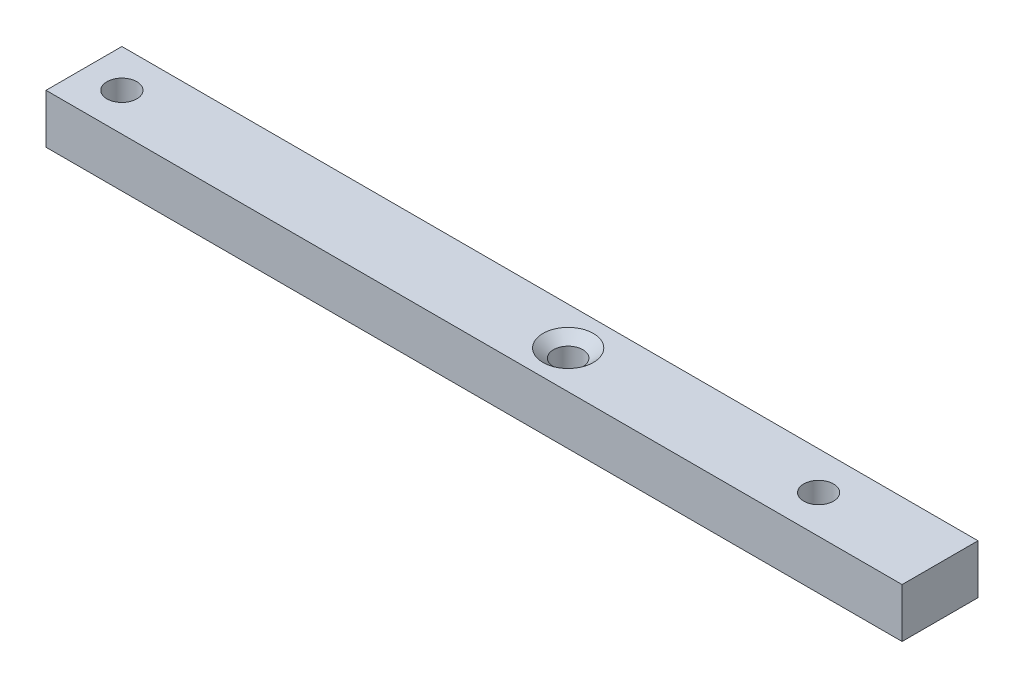
ISO-10303-21;
HEADER;
FILE_DESCRIPTION(('STEP AP214'),'2;1');
FILE_NAME('part.step','',(''),(''),'','','');
FILE_SCHEMA(('AUTOMOTIVE_DESIGN { 1 0 10303 214 1 1 1 1 }'));
ENDSEC;
DATA;
#1=APPLICATION_CONTEXT('core data for automotive mechanical design processes');
#2=APPLICATION_PROTOCOL_DEFINITION('international standard','automotive_design',2000,#1);
#3=PRODUCT_CONTEXT('',#1,'mechanical');
#4=PRODUCT('Part','Part','',(#3));
#5=PRODUCT_RELATED_PRODUCT_CATEGORY('part','',(#4));
#6=PRODUCT_DEFINITION_FORMATION('','',#4);
#7=PRODUCT_DEFINITION_CONTEXT('part definition',#1,'design');
#8=PRODUCT_DEFINITION('design','',#6,#7);
#9=PRODUCT_DEFINITION_SHAPE('','',#8);
#10=(LENGTH_UNIT() NAMED_UNIT(*) SI_UNIT(.MILLI.,.METRE.));
#11=(NAMED_UNIT(*) PLANE_ANGLE_UNIT() SI_UNIT($,.RADIAN.));
#12=(NAMED_UNIT(*) SI_UNIT($,.STERADIAN.) SOLID_ANGLE_UNIT());
#13=UNCERTAINTY_MEASURE_WITH_UNIT(LENGTH_MEASURE(1.E-05),#10,'distance_accuracy_value','');
#14=(GEOMETRIC_REPRESENTATION_CONTEXT(3) GLOBAL_UNCERTAINTY_ASSIGNED_CONTEXT((#13)) GLOBAL_UNIT_ASSIGNED_CONTEXT((#10,
#11,#12)) REPRESENTATION_CONTEXT('',''));
#15=CARTESIAN_POINT('',(0.,0.,0.));
#16=DIRECTION('',(0.,0.,1.));
#17=DIRECTION('',(1.,0.,0.));
#18=AXIS2_PLACEMENT_3D('',#15,#16,#17);
#19=CARTESIAN_POINT('',(-64.4962077922078,8.255,-10.749367965368));
#20=DIRECTION('',(1.,0.,0.));
#21=DIRECTION('',(0.,0.,-1.));
#22=AXIS2_PLACEMENT_3D('',#19,#20,#21);
#23=PLANE('',#22);
#24=DIRECTION('',(0.,0.,1.));
#25=VECTOR('',#24,1.);
#26=CARTESIAN_POINT('',(-64.4962077922078,0.,-10.749367965368));
#27=LINE('',#26,#25);
#28=CARTESIAN_POINT('',(-64.4962077922078,0.,-10.749367965368));
#29=VERTEX_POINT('',#28);
#30=CARTESIAN_POINT('',(-64.4962077922078,0.,1.95063203463203));
#31=VERTEX_POINT('',#30);
#32=EDGE_CURVE('E125',#29,#31,#27,.T.);
#33=ORIENTED_EDGE('',*,*,#32,.T.);
#34=DIRECTION('',(0.,-1.,0.));
#35=VECTOR('',#34,1.);
#36=CARTESIAN_POINT('',(-64.4962077922078,8.255,1.95063203463203));
#37=LINE('',#36,#35);
#38=CARTESIAN_POINT('',(-64.4962077922078,8.255,1.95063203463203));
#39=VERTEX_POINT('',#38);
#40=EDGE_CURVE('E11',#39,#31,#37,.T.);
#41=ORIENTED_EDGE('',*,*,#40,.F.);
#42=DIRECTION('',(0.,0.,1.));
#43=VECTOR('',#42,1.);
#44=CARTESIAN_POINT('',(-64.4962077922078,8.255,-10.749367965368));
#45=LINE('',#44,#43);
#46=CARTESIAN_POINT('',(-64.4962077922078,8.255,-10.749367965368));
#47=VERTEX_POINT('',#46);
#48=EDGE_CURVE('E126',#47,#39,#45,.T.);
#49=ORIENTED_EDGE('',*,*,#48,.F.);
#50=DIRECTION('',(0.,-1.,0.));
#51=VECTOR('',#50,1.);
#52=CARTESIAN_POINT('',(-64.4962077922078,8.255,-10.749367965368));
#53=LINE('',#52,#51);
#54=EDGE_CURVE('E132',#47,#29,#53,.T.);
#55=ORIENTED_EDGE('',*,*,#54,.T.);
#56=EDGE_LOOP('',(#33,#41,#49,#55));
#57=FACE_BOUND('',#56,.T.);
#58=ADVANCED_FACE('F39',(#57),#23,.F.);
#59=CARTESIAN_POINT('',(-64.4962077922078,8.255,1.95063203463203));
#60=DIRECTION('',(0.,0.,-1.));
#61=DIRECTION('',(-1.,0.,0.));
#62=AXIS2_PLACEMENT_3D('',#59,#60,#61);
#63=PLANE('',#62);
#64=DIRECTION('',(1.,0.,0.));
#65=VECTOR('',#64,1.);
#66=CARTESIAN_POINT('',(-64.4962077922078,0.,1.95063203463203));
#67=LINE('',#66,#65);
#68=CARTESIAN_POINT('',(78.7597922077922,0.,1.95063203463203));
#69=VERTEX_POINT('',#68);
#70=EDGE_CURVE('E135',#31,#69,#67,.T.);
#71=ORIENTED_EDGE('',*,*,#70,.T.);
#72=DIRECTION('',(0.,-1.,0.));
#73=VECTOR('',#72,1.);
#74=CARTESIAN_POINT('',(78.7597922077922,8.255,1.95063203463203));
#75=LINE('',#74,#73);
#76=CARTESIAN_POINT('',(78.7597922077922,8.255,1.95063203463203));
#77=VERTEX_POINT('',#76);
#78=EDGE_CURVE('E47',#77,#69,#75,.T.);
#79=ORIENTED_EDGE('',*,*,#78,.F.);
#80=DIRECTION('',(1.,0.,0.));
#81=VECTOR('',#80,1.);
#82=CARTESIAN_POINT('',(-64.4962077922078,8.255,1.95063203463203));
#83=LINE('',#82,#81);
#84=EDGE_CURVE('E86',#39,#77,#83,.T.);
#85=ORIENTED_EDGE('',*,*,#84,.F.);
#86=ORIENTED_EDGE('',*,*,#40,.T.);
#87=EDGE_LOOP('',(#71,#79,#85,#86));
#88=FACE_BOUND('',#87,.T.);
#89=ADVANCED_FACE('F159',(#88),#63,.F.);
#90=CARTESIAN_POINT('',(78.7597922077922,8.255,-10.749367965368));
#91=DIRECTION('',(-1.,0.,0.));
#92=DIRECTION('',(0.,0.,1.));
#93=AXIS2_PLACEMENT_3D('',#90,#91,#92);
#94=PLANE('',#93);
#95=DIRECTION('',(0.,0.,-1.));
#96=VECTOR('',#95,1.);
#97=CARTESIAN_POINT('',(78.7597922077922,0.,-10.749367965368));
#98=LINE('',#97,#96);
#99=CARTESIAN_POINT('',(78.7597922077922,0.,-10.749367965368));
#100=VERTEX_POINT('',#99);
#101=EDGE_CURVE('E73',#69,#100,#98,.T.);
#102=ORIENTED_EDGE('',*,*,#101,.T.);
#103=DIRECTION('',(0.,-1.,0.));
#104=VECTOR('',#103,1.);
#105=CARTESIAN_POINT('',(78.7597922077922,8.255,-10.749367965368));
#106=LINE('',#105,#104);
#107=CARTESIAN_POINT('',(78.7597922077922,8.255,-10.749367965368));
#108=VERTEX_POINT('',#107);
#109=EDGE_CURVE('E140',#108,#100,#106,.T.);
#110=ORIENTED_EDGE('',*,*,#109,.F.);
#111=DIRECTION('',(0.,0.,-1.));
#112=VECTOR('',#111,1.);
#113=CARTESIAN_POINT('',(78.7597922077922,8.255,-10.749367965368));
#114=LINE('',#113,#112);
#115=EDGE_CURVE('E129',#77,#108,#114,.T.);
#116=ORIENTED_EDGE('',*,*,#115,.F.);
#117=ORIENTED_EDGE('',*,*,#78,.T.);
#118=EDGE_LOOP('',(#102,#110,#116,#117));
#119=FACE_BOUND('',#118,.T.);
#120=ADVANCED_FACE('F142',(#119),#94,.F.);
#121=CARTESIAN_POINT('',(-64.4962077922078,8.255,-10.749367965368));
#122=DIRECTION('',(0.,0.,1.));
#123=DIRECTION('',(1.,0.,0.));
#124=AXIS2_PLACEMENT_3D('',#121,#122,#123);
#125=PLANE('',#124);
#126=DIRECTION('',(-1.,0.,0.));
#127=VECTOR('',#126,1.);
#128=CARTESIAN_POINT('',(-64.4962077922078,0.,-10.749367965368));
#129=LINE('',#128,#127);
#130=EDGE_CURVE('E79',#100,#29,#129,.T.);
#131=ORIENTED_EDGE('',*,*,#130,.T.);
#132=ORIENTED_EDGE('',*,*,#54,.F.);
#133=DIRECTION('',(-1.,0.,0.));
#134=VECTOR('',#133,1.);
#135=CARTESIAN_POINT('',(-64.4962077922078,8.255,-10.749367965368));
#136=LINE('',#135,#134);
#137=EDGE_CURVE('E55',#108,#47,#136,.T.);
#138=ORIENTED_EDGE('',*,*,#137,.F.);
#139=ORIENTED_EDGE('',*,*,#109,.T.);
#140=EDGE_LOOP('',(#131,#132,#138,#139));
#141=FACE_BOUND('',#140,.T.);
#142=ADVANCED_FACE('F149',(#141),#125,.F.);
#143=CARTESIAN_POINT('',(0.,8.255,0.));
#144=DIRECTION('',(0.,1.,0.));
#145=DIRECTION('',(0.,0.,1.));
#146=AXIS2_PLACEMENT_3D('',#143,#144,#145);
#147=PLANE('',#146);
#148=CARTESIAN_POINT('',(58.4397922077922,8.255,-4.39936796536797));
#149=DIRECTION('',(0.,1.,0.));
#150=DIRECTION('',(0.,0.,1.));
#151=AXIS2_PLACEMENT_3D('',#148,#149,#150);
#152=CIRCLE('',#151,2.5);
#153=CARTESIAN_POINT('',(58.4397922077922,8.255,-1.89936796536796));
#154=VERTEX_POINT('',#153);
#155=EDGE_CURVE('E274',#154,#154,#152,.T.);
#156=ORIENTED_EDGE('',*,*,#155,.F.);
#157=EDGE_LOOP('',(#156));
#158=FACE_BOUND('',#157,.T.);
#159=CARTESIAN_POINT('',(-58.1462077922078,8.255,-4.39936796536797));
#160=DIRECTION('',(0.,1.,0.));
#161=DIRECTION('',(0.,0.,1.));
#162=AXIS2_PLACEMENT_3D('',#159,#160,#161);
#163=CIRCLE('',#162,2.5);
#164=CARTESIAN_POINT('',(-58.1462077922078,8.255,-1.89936796536796));
#165=VERTEX_POINT('',#164);
#166=EDGE_CURVE('E276',#165,#165,#163,.T.);
#167=ORIENTED_EDGE('',*,*,#166,.F.);
#168=EDGE_LOOP('',(#167));
#169=FACE_BOUND('',#168,.T.);
#170=CARTESIAN_POINT('',(16.5297922077922,8.255,-4.39936796536797));
#171=DIRECTION('',(0.,1.,0.));
#172=DIRECTION('',(0.,0.,1.));
#173=AXIS2_PLACEMENT_3D('',#170,#171,#172);
#174=CIRCLE('',#173,4.2164);
#175=CARTESIAN_POINT('',(16.5297922077922,8.255,-0.182967965367964));
#176=VERTEX_POINT('',#175);
#177=EDGE_CURVE('E116',#176,#176,#174,.T.);
#178=ORIENTED_EDGE('',*,*,#177,.F.);
#179=EDGE_LOOP('',(#178));
#180=FACE_BOUND('',#179,.T.);
#181=ORIENTED_EDGE('',*,*,#48,.T.);
#182=ORIENTED_EDGE('',*,*,#84,.T.);
#183=ORIENTED_EDGE('',*,*,#115,.T.);
#184=ORIENTED_EDGE('',*,*,#137,.T.);
#185=EDGE_LOOP('',(#181,#182,#183,#184));
#186=FACE_BOUND('',#185,.T.);
#187=ADVANCED_FACE('F151',(#158,#169,#180,#186),#147,.T.);
#188=CARTESIAN_POINT('',(0.,0.,0.));
#189=DIRECTION('',(0.,1.,0.));
#190=DIRECTION('',(0.,0.,1.));
#191=AXIS2_PLACEMENT_3D('',#188,#189,#190);
#192=PLANE('',#191);
#193=CARTESIAN_POINT('',(58.4397922077922,0.,-4.39936796536797));
#194=DIRECTION('',(0.,1.,0.));
#195=DIRECTION('',(0.,0.,1.));
#196=AXIS2_PLACEMENT_3D('',#193,#194,#195);
#197=CIRCLE('',#196,2.5);
#198=CARTESIAN_POINT('',(58.4397922077922,0.,-1.89936796536797));
#199=VERTEX_POINT('',#198);
#200=EDGE_CURVE('E271',#199,#199,#197,.T.);
#201=ORIENTED_EDGE('',*,*,#200,.T.);
#202=EDGE_LOOP('',(#201));
#203=FACE_BOUND('',#202,.T.);
#204=CARTESIAN_POINT('',(-58.1462077922078,0.,-4.39936796536797));
#205=DIRECTION('',(0.,1.,0.));
#206=DIRECTION('',(0.,0.,1.));
#207=AXIS2_PLACEMENT_3D('',#204,#205,#206);
#208=CIRCLE('',#207,2.5);
#209=CARTESIAN_POINT('',(-58.1462077922078,0.,-1.89936796536797));
#210=VERTEX_POINT('',#209);
#211=EDGE_CURVE('E110',#210,#210,#208,.T.);
#212=ORIENTED_EDGE('',*,*,#211,.T.);
#213=EDGE_LOOP('',(#212));
#214=FACE_BOUND('',#213,.T.);
#215=CARTESIAN_POINT('',(-50.0275223258093,0.,-2.74836796536797));
#216=DIRECTION('',(0.,-1.,0.));
#217=DIRECTION('',(0.,0.,-1.));
#218=AXIS2_PLACEMENT_3D('',#215,#216,#217);
#219=CIRCLE('',#218,0.888999999999987);
#220=CARTESIAN_POINT('',(-50.0275223258093,0.,-3.63736796536795));
#221=VERTEX_POINT('',#220);
#222=EDGE_CURVE('E104',#221,#221,#219,.T.);
#223=ORIENTED_EDGE('',*,*,#222,.F.);
#224=EDGE_LOOP('',(#223));
#225=FACE_BOUND('',#224,.T.);
#226=CARTESIAN_POINT('',(-40.5025223258093,0.,-2.74836796536797));
#227=DIRECTION('',(0.,-1.,0.));
#228=DIRECTION('',(0.,0.,-1.));
#229=AXIS2_PLACEMENT_3D('',#226,#227,#228);
#230=CIRCLE('',#229,0.888999999999987);
#231=CARTESIAN_POINT('',(-40.5025223258093,0.,-3.63736796536795));
#232=VERTEX_POINT('',#231);
#233=EDGE_CURVE('E103',#232,#232,#230,.T.);
#234=ORIENTED_EDGE('',*,*,#233,.F.);
#235=EDGE_LOOP('',(#234));
#236=FACE_BOUND('',#235,.T.);
#237=CARTESIAN_POINT('',(16.5297922077922,0.,-4.39936796536797));
#238=DIRECTION('',(0.,1.,0.));
#239=DIRECTION('',(0.,0.,1.));
#240=AXIS2_PLACEMENT_3D('',#237,#238,#239);
#241=CIRCLE('',#240,2.45745);
#242=CARTESIAN_POINT('',(16.5297922077922,0.,-1.94191796536797));
#243=VERTEX_POINT('',#242);
#244=EDGE_CURVE('E122',#243,#243,#241,.T.);
#245=ORIENTED_EDGE('',*,*,#244,.T.);
#246=EDGE_LOOP('',(#245));
#247=FACE_BOUND('',#246,.T.);
#248=ORIENTED_EDGE('',*,*,#32,.F.);
#249=ORIENTED_EDGE('',*,*,#130,.F.);
#250=ORIENTED_EDGE('',*,*,#101,.F.);
#251=ORIENTED_EDGE('',*,*,#70,.F.);
#252=EDGE_LOOP('',(#248,#249,#250,#251));
#253=FACE_BOUND('',#252,.T.);
#254=ADVANCED_FACE('F145',(#203,#214,#225,#236,#247,#253),#192,.F.);
#255=CARTESIAN_POINT('',(16.5297922077922,8.255,-4.39936796536797));
#256=DIRECTION('',(0.,1.,0.));
#257=DIRECTION('',(0.,0.,1.));
#258=AXIS2_PLACEMENT_3D('',#255,#256,#257);
#259=CYLINDRICAL_SURFACE('',#258,2.45745);
#260=ORIENTED_EDGE('',*,*,#244,.F.);
#261=EDGE_LOOP('',(#260));
#262=FACE_BOUND('',#261,.T.);
#263=CARTESIAN_POINT('',(16.5297922077922,6.77906570374072,-4.39936796536797));
#264=DIRECTION('',(0.,1.,0.));
#265=DIRECTION('',(0.,0.,1.));
#266=AXIS2_PLACEMENT_3D('',#263,#264,#265);
#267=CIRCLE('',#266,2.45745);
#268=CARTESIAN_POINT('',(16.5297922077922,6.77906570374072,-1.94191796536797));
#269=VERTEX_POINT('',#268);
#270=EDGE_CURVE('E119',#269,#269,#267,.T.);
#271=ORIENTED_EDGE('',*,*,#270,.T.);
#272=EDGE_LOOP('',(#271));
#273=FACE_BOUND('',#272,.T.);
#274=ADVANCED_FACE('F183',(#262,#273),#259,.F.);
#275=CARTESIAN_POINT('',(16.5297922077922,8.255,-4.39936796536797));
#276=DIRECTION('',(0.,1.,0.));
#277=DIRECTION('',(0.,0.,1.));
#278=AXIS2_PLACEMENT_3D('',#275,#276,#277);
#279=CONICAL_SURFACE('',#278,4.2164,0.872664625997165);
#280=ORIENTED_EDGE('',*,*,#270,.F.);
#281=EDGE_LOOP('',(#280));
#282=FACE_BOUND('',#281,.T.);
#283=ORIENTED_EDGE('',*,*,#177,.T.);
#284=EDGE_LOOP('',(#283));
#285=FACE_BOUND('',#284,.T.);
#286=ADVANCED_FACE('F188',(#282,#285),#279,.F.);
#287=CARTESIAN_POINT('',(-40.5025223258093,6.35,-2.74836796536797));
#288=DIRECTION('',(0.,-1.,0.));
#289=DIRECTION('',(0.,0.,-1.));
#290=AXIS2_PLACEMENT_3D('',#287,#288,#289);
#291=CONICAL_SURFACE('',#290,0.889000000000001,1.02974425867665);
#292=CARTESIAN_POINT('',(-40.5025223258093,6.8841650903155,-2.74836796536797));
#293=VERTEX_POINT('',#292);
#294=VERTEX_LOOP('',#293);
#295=FACE_BOUND('',#294,.T.);
#296=CARTESIAN_POINT('',(-40.5025223258093,6.35,-2.74836796536797));
#297=DIRECTION('',(0.,-1.,0.));
#298=DIRECTION('',(0.,0.,-1.));
#299=AXIS2_PLACEMENT_3D('',#296,#297,#298);
#300=CIRCLE('',#299,0.889000000000001);
#301=CARTESIAN_POINT('',(-40.5025223258093,6.35,-3.63736796536797));
#302=VERTEX_POINT('',#301);
#303=EDGE_CURVE('E107',#302,#302,#300,.T.);
#304=ORIENTED_EDGE('',*,*,#303,.T.);
#305=EDGE_LOOP('',(#304));
#306=FACE_BOUND('',#305,.T.);
#307=ADVANCED_FACE('F200',(#295,#306),#291,.F.);
#308=CARTESIAN_POINT('',(-40.5025223258093,0.,-2.74836796536797));
#309=DIRECTION('',(0.,-1.,0.));
#310=DIRECTION('',(0.,0.,-1.));
#311=AXIS2_PLACEMENT_3D('',#308,#309,#310);
#312=CYLINDRICAL_SURFACE('',#311,0.888999999999994);
#313=ORIENTED_EDGE('',*,*,#303,.F.);
#314=EDGE_LOOP('',(#313));
#315=FACE_BOUND('',#314,.T.);
#316=ORIENTED_EDGE('',*,*,#233,.T.);
#317=EDGE_LOOP('',(#316));
#318=FACE_BOUND('',#317,.T.);
#319=ADVANCED_FACE('F97',(#315,#318),#312,.F.);
#320=CARTESIAN_POINT('',(-50.0275223258093,6.35,-2.74836796536797));
#321=DIRECTION('',(0.,-1.,0.));
#322=DIRECTION('',(0.,0.,-1.));
#323=AXIS2_PLACEMENT_3D('',#320,#321,#322);
#324=CONICAL_SURFACE('',#323,0.889000000000001,1.02974425867665);
#325=CARTESIAN_POINT('',(-50.0275223258093,6.8841650903155,-2.74836796536797));
#326=VERTEX_POINT('',#325);
#327=VERTEX_LOOP('',#326);
#328=FACE_BOUND('',#327,.T.);
#329=CARTESIAN_POINT('',(-50.0275223258093,6.35,-2.74836796536797));
#330=DIRECTION('',(0.,-1.,0.));
#331=DIRECTION('',(0.,0.,-1.));
#332=AXIS2_PLACEMENT_3D('',#329,#330,#331);
#333=CIRCLE('',#332,0.889000000000001);
#334=CARTESIAN_POINT('',(-50.0275223258093,6.35,-3.63736796536797));
#335=VERTEX_POINT('',#334);
#336=EDGE_CURVE('E101',#335,#335,#333,.T.);
#337=ORIENTED_EDGE('',*,*,#336,.T.);
#338=EDGE_LOOP('',(#337));
#339=FACE_BOUND('',#338,.T.);
#340=ADVANCED_FACE('F93',(#328,#339),#324,.F.);
#341=CARTESIAN_POINT('',(-50.0275223258093,0.,-2.74836796536797));
#342=DIRECTION('',(0.,-1.,0.));
#343=DIRECTION('',(0.,0.,-1.));
#344=AXIS2_PLACEMENT_3D('',#341,#342,#343);
#345=CYLINDRICAL_SURFACE('',#344,0.888999999999994);
#346=ORIENTED_EDGE('',*,*,#336,.F.);
#347=EDGE_LOOP('',(#346));
#348=FACE_BOUND('',#347,.T.);
#349=ORIENTED_EDGE('',*,*,#222,.T.);
#350=EDGE_LOOP('',(#349));
#351=FACE_BOUND('',#350,.T.);
#352=ADVANCED_FACE('F96',(#348,#351),#345,.F.);
#353=CARTESIAN_POINT('',(-58.1462077922078,8.255,-4.39936796536797));
#354=DIRECTION('',(0.,1.,0.));
#355=DIRECTION('',(0.,0.,1.));
#356=AXIS2_PLACEMENT_3D('',#353,#354,#355);
#357=CYLINDRICAL_SURFACE('',#356,2.5);
#358=ORIENTED_EDGE('',*,*,#211,.F.);
#359=EDGE_LOOP('',(#358));
#360=FACE_BOUND('',#359,.T.);
#361=ORIENTED_EDGE('',*,*,#166,.T.);
#362=EDGE_LOOP('',(#361));
#363=FACE_BOUND('',#362,.T.);
#364=ADVANCED_FACE('F234',(#360,#363),#357,.F.);
#365=CARTESIAN_POINT('',(58.4397922077922,8.255,-4.39936796536797));
#366=DIRECTION('',(0.,1.,0.));
#367=DIRECTION('',(0.,0.,1.));
#368=AXIS2_PLACEMENT_3D('',#365,#366,#367);
#369=CYLINDRICAL_SURFACE('',#368,2.5);
#370=ORIENTED_EDGE('',*,*,#200,.F.);
#371=EDGE_LOOP('',(#370));
#372=FACE_BOUND('',#371,.T.);
#373=ORIENTED_EDGE('',*,*,#155,.T.);
#374=EDGE_LOOP('',(#373));
#375=FACE_BOUND('',#374,.T.);
#376=ADVANCED_FACE('F254',(#372,#375),#369,.F.);
#377=CLOSED_SHELL('',(#58,#89,#120,#142,#187,#254,#274,#286,#307,#319,#340,#352,#364,#376));
#378=MANIFOLD_SOLID_BREP('B2',#377);
#379=ADVANCED_BREP_SHAPE_REPRESENTATION('',(#18,#378),#14);
#380=SHAPE_DEFINITION_REPRESENTATION(#9,#379);
ENDSEC;
END-ISO-10303-21;
